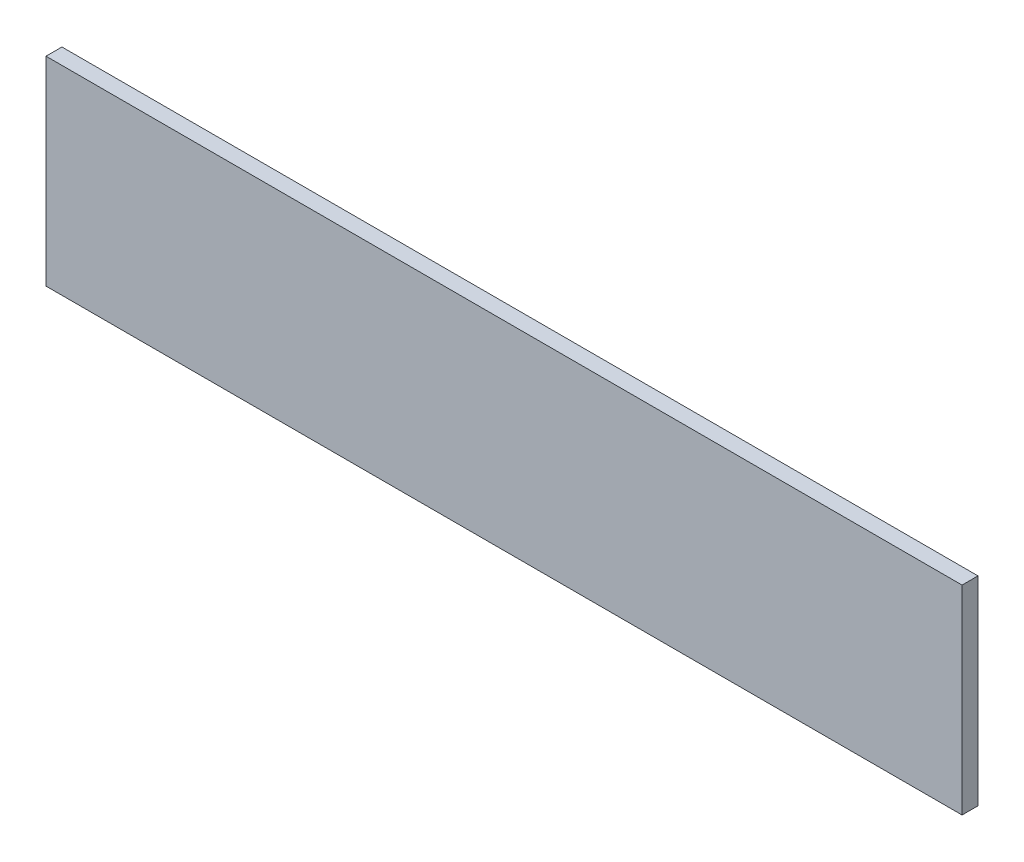
ISO-10303-21;
HEADER;
FILE_DESCRIPTION(('STEP AP214'),'2;1');
FILE_NAME('part.step','',(''),(''),'','','');
FILE_SCHEMA(('AUTOMOTIVE_DESIGN { 1 0 10303 214 1 1 1 1 }'));
ENDSEC;
DATA;
#1=APPLICATION_CONTEXT('core data for automotive mechanical design processes');
#2=APPLICATION_PROTOCOL_DEFINITION('international standard','automotive_design',2000,#1);
#3=PRODUCT_CONTEXT('',#1,'mechanical');
#4=PRODUCT('Part','Part','',(#3));
#5=PRODUCT_RELATED_PRODUCT_CATEGORY('part','',(#4));
#6=PRODUCT_DEFINITION_FORMATION('','',#4);
#7=PRODUCT_DEFINITION_CONTEXT('part definition',#1,'design');
#8=PRODUCT_DEFINITION('design','',#6,#7);
#9=PRODUCT_DEFINITION_SHAPE('','',#8);
#10=(LENGTH_UNIT() NAMED_UNIT(*) SI_UNIT(.MILLI.,.METRE.));
#11=(NAMED_UNIT(*) PLANE_ANGLE_UNIT() SI_UNIT($,.RADIAN.));
#12=(NAMED_UNIT(*) SI_UNIT($,.STERADIAN.) SOLID_ANGLE_UNIT());
#13=UNCERTAINTY_MEASURE_WITH_UNIT(LENGTH_MEASURE(1.E-05),#10,'distance_accuracy_value','');
#14=(GEOMETRIC_REPRESENTATION_CONTEXT(3) GLOBAL_UNCERTAINTY_ASSIGNED_CONTEXT((#13)) GLOBAL_UNIT_ASSIGNED_CONTEXT((#10,
#11,#12)) REPRESENTATION_CONTEXT('',''));
#15=CARTESIAN_POINT('',(0.,0.,0.));
#16=DIRECTION('',(0.,0.,1.));
#17=DIRECTION('',(1.,0.,0.));
#18=AXIS2_PLACEMENT_3D('',#15,#16,#17);
#19=CARTESIAN_POINT('',(0.,50.,4.));
#20=DIRECTION('',(1.,0.,0.));
#21=DIRECTION('',(0.,1.,0.));
#22=AXIS2_PLACEMENT_3D('',#19,#20,#21);
#23=PLANE('',#22);
#24=DIRECTION('',(0.,-1.,0.));
#25=VECTOR('',#24,1.);
#26=CARTESIAN_POINT('',(0.,50.,0.));
#27=LINE('',#26,#25);
#28=CARTESIAN_POINT('',(0.,50.,0.));
#29=VERTEX_POINT('',#28);
#30=CARTESIAN_POINT('',(0.,0.,0.));
#31=VERTEX_POINT('',#30);
#32=EDGE_CURVE('E111',#29,#31,#27,.T.);
#33=ORIENTED_EDGE('',*,*,#32,.T.);
#34=DIRECTION('',(0.,0.,-1.));
#35=VECTOR('',#34,1.);
#36=CARTESIAN_POINT('',(0.,0.,4.));
#37=LINE('',#36,#35);
#38=CARTESIAN_POINT('',(0.,0.,4.));
#39=VERTEX_POINT('',#38);
#40=EDGE_CURVE('E11',#39,#31,#37,.T.);
#41=ORIENTED_EDGE('',*,*,#40,.F.);
#42=DIRECTION('',(0.,-1.,0.));
#43=VECTOR('',#42,1.);
#44=CARTESIAN_POINT('',(0.,50.,4.));
#45=LINE('',#44,#43);
#46=CARTESIAN_POINT('',(0.,50.,4.));
#47=VERTEX_POINT('',#46);
#48=EDGE_CURVE('E100',#47,#39,#45,.T.);
#49=ORIENTED_EDGE('',*,*,#48,.F.);
#50=DIRECTION('',(0.,0.,-1.));
#51=VECTOR('',#50,1.);
#52=CARTESIAN_POINT('',(0.,50.,4.));
#53=LINE('',#52,#51);
#54=EDGE_CURVE('E108',#47,#29,#53,.T.);
#55=ORIENTED_EDGE('',*,*,#54,.T.);
#56=EDGE_LOOP('',(#33,#41,#49,#55));
#57=FACE_BOUND('',#56,.T.);
#58=ADVANCED_FACE('F44',(#57),#23,.F.);
#59=CARTESIAN_POINT('',(0.,0.,4.));
#60=DIRECTION('',(0.,1.,0.));
#61=DIRECTION('',(0.,0.,1.));
#62=AXIS2_PLACEMENT_3D('',#59,#60,#61);
#63=PLANE('',#62);
#64=DIRECTION('',(1.,0.,0.));
#65=VECTOR('',#64,1.);
#66=CARTESIAN_POINT('',(0.,0.,0.));
#67=LINE('',#66,#65);
#68=CARTESIAN_POINT('',(230.,0.,0.));
#69=VERTEX_POINT('',#68);
#70=EDGE_CURVE('E105',#31,#69,#67,.T.);
#71=ORIENTED_EDGE('',*,*,#70,.T.);
#72=DIRECTION('',(0.,0.,-1.));
#73=VECTOR('',#72,1.);
#74=CARTESIAN_POINT('',(230.,0.,4.));
#75=LINE('',#74,#73);
#76=CARTESIAN_POINT('',(230.,0.,4.));
#77=VERTEX_POINT('',#76);
#78=EDGE_CURVE('E53',#77,#69,#75,.T.);
#79=ORIENTED_EDGE('',*,*,#78,.F.);
#80=DIRECTION('',(1.,0.,0.));
#81=VECTOR('',#80,1.);
#82=CARTESIAN_POINT('',(0.,0.,4.));
#83=LINE('',#82,#81);
#84=EDGE_CURVE('E95',#39,#77,#83,.T.);
#85=ORIENTED_EDGE('',*,*,#84,.F.);
#86=ORIENTED_EDGE('',*,*,#40,.T.);
#87=EDGE_LOOP('',(#71,#79,#85,#86));
#88=FACE_BOUND('',#87,.T.);
#89=ADVANCED_FACE('F102',(#88),#63,.F.);
#90=CARTESIAN_POINT('',(230.,0.,4.));
#91=DIRECTION('',(-1.,0.,0.));
#92=DIRECTION('',(0.,0.,1.));
#93=AXIS2_PLACEMENT_3D('',#90,#91,#92);
#94=PLANE('',#93);
#95=DIRECTION('',(0.,1.,0.));
#96=VECTOR('',#95,1.);
#97=CARTESIAN_POINT('',(230.,0.,0.));
#98=LINE('',#97,#96);
#99=CARTESIAN_POINT('',(230.,50.,0.));
#100=VERTEX_POINT('',#99);
#101=EDGE_CURVE('E80',#69,#100,#98,.T.);
#102=ORIENTED_EDGE('',*,*,#101,.T.);
#103=DIRECTION('',(0.,0.,-1.));
#104=VECTOR('',#103,1.);
#105=CARTESIAN_POINT('',(230.,50.,4.));
#106=LINE('',#105,#104);
#107=CARTESIAN_POINT('',(230.,50.,4.));
#108=VERTEX_POINT('',#107);
#109=EDGE_CURVE('E101',#108,#100,#106,.T.);
#110=ORIENTED_EDGE('',*,*,#109,.F.);
#111=DIRECTION('',(0.,1.,0.));
#112=VECTOR('',#111,1.);
#113=CARTESIAN_POINT('',(230.,0.,4.));
#114=LINE('',#113,#112);
#115=EDGE_CURVE('E94',#77,#108,#114,.T.);
#116=ORIENTED_EDGE('',*,*,#115,.F.);
#117=ORIENTED_EDGE('',*,*,#78,.T.);
#118=EDGE_LOOP('',(#102,#110,#116,#117));
#119=FACE_BOUND('',#118,.T.);
#120=ADVANCED_FACE('F103',(#119),#94,.F.);
#121=CARTESIAN_POINT('',(230.,50.,4.));
#122=DIRECTION('',(0.,-1.,0.));
#123=DIRECTION('',(1.,0.,0.));
#124=AXIS2_PLACEMENT_3D('',#121,#122,#123);
#125=PLANE('',#124);
#126=DIRECTION('',(-1.,0.,0.));
#127=VECTOR('',#126,1.);
#128=CARTESIAN_POINT('',(230.,50.,0.));
#129=LINE('',#128,#127);
#130=EDGE_CURVE('E82',#100,#29,#129,.T.);
#131=ORIENTED_EDGE('',*,*,#130,.T.);
#132=ORIENTED_EDGE('',*,*,#54,.F.);
#133=DIRECTION('',(-1.,0.,0.));
#134=VECTOR('',#133,1.);
#135=CARTESIAN_POINT('',(230.,50.,4.));
#136=LINE('',#135,#134);
#137=EDGE_CURVE('E62',#108,#47,#136,.T.);
#138=ORIENTED_EDGE('',*,*,#137,.F.);
#139=ORIENTED_EDGE('',*,*,#109,.T.);
#140=EDGE_LOOP('',(#131,#132,#138,#139));
#141=FACE_BOUND('',#140,.T.);
#142=ADVANCED_FACE('F128',(#141),#125,.F.);
#143=CARTESIAN_POINT('',(0.,0.,4.));
#144=DIRECTION('',(0.,0.,1.));
#145=DIRECTION('',(1.,0.,0.));
#146=AXIS2_PLACEMENT_3D('',#143,#144,#145);
#147=PLANE('',#146);
#148=ORIENTED_EDGE('',*,*,#48,.T.);
#149=ORIENTED_EDGE('',*,*,#84,.T.);
#150=ORIENTED_EDGE('',*,*,#115,.T.);
#151=ORIENTED_EDGE('',*,*,#137,.T.);
#152=EDGE_LOOP('',(#148,#149,#150,#151));
#153=FACE_BOUND('',#152,.T.);
#154=ADVANCED_FACE('F93',(#153),#147,.T.);
#155=CARTESIAN_POINT('',(0.,0.,0.));
#156=DIRECTION('',(0.,0.,1.));
#157=DIRECTION('',(1.,0.,0.));
#158=AXIS2_PLACEMENT_3D('',#155,#156,#157);
#159=PLANE('',#158);
#160=ORIENTED_EDGE('',*,*,#32,.F.);
#161=ORIENTED_EDGE('',*,*,#130,.F.);
#162=ORIENTED_EDGE('',*,*,#101,.F.);
#163=ORIENTED_EDGE('',*,*,#70,.F.);
#164=EDGE_LOOP('',(#160,#161,#162,#163));
#165=FACE_BOUND('',#164,.T.);
#166=ADVANCED_FACE('F129',(#165),#159,.F.);
#167=CLOSED_SHELL('',(#58,#89,#120,#142,#154,#166));
#168=MANIFOLD_SOLID_BREP('B2',#167);
#169=ADVANCED_BREP_SHAPE_REPRESENTATION('',(#18,#168),#14);
#170=SHAPE_DEFINITION_REPRESENTATION(#9,#169);
ENDSEC;
END-ISO-10303-21;
